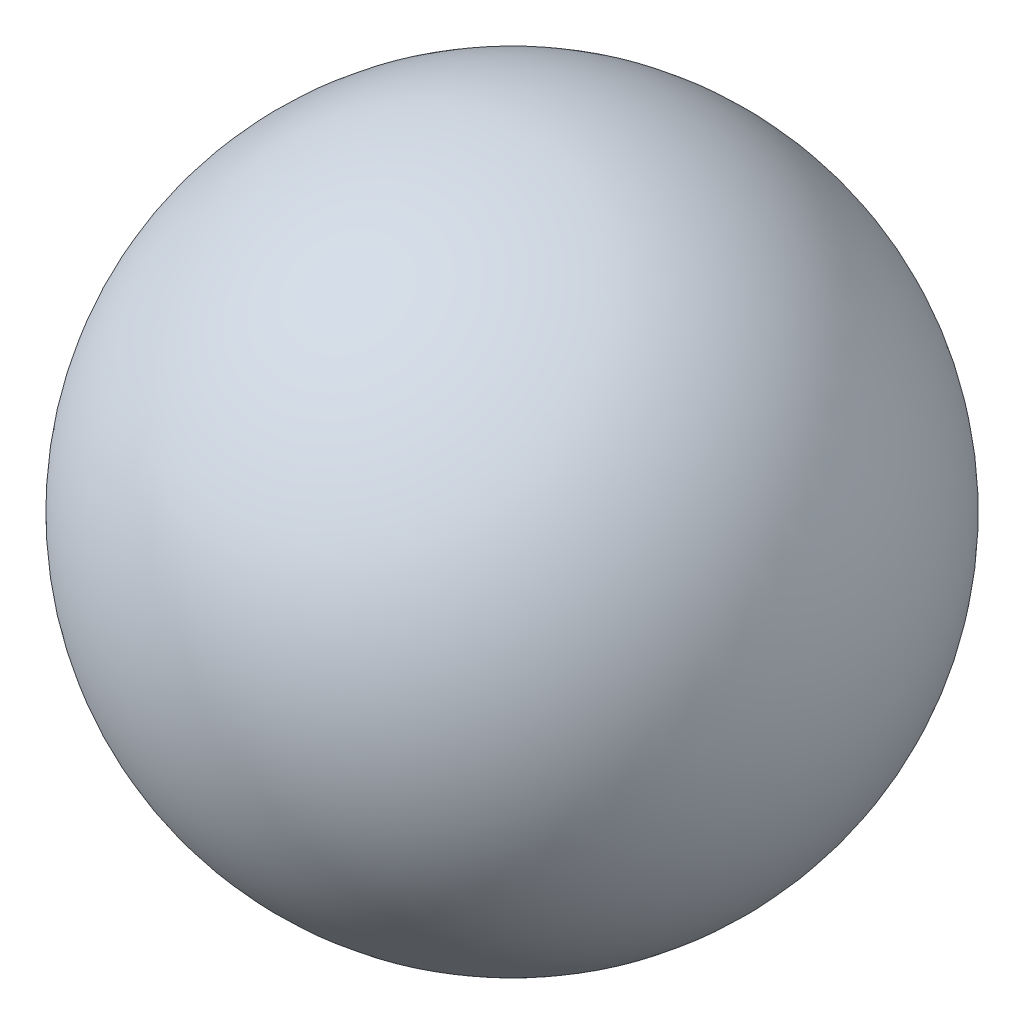
ISO-10303-21;
HEADER;
FILE_DESCRIPTION(('STEP AP214'),'2;1');
FILE_NAME('part.step','',(''),(''),'','','');
FILE_SCHEMA(('AUTOMOTIVE_DESIGN { 1 0 10303 214 1 1 1 1 }'));
ENDSEC;
DATA;
#1=APPLICATION_CONTEXT('core data for automotive mechanical design processes');
#2=APPLICATION_PROTOCOL_DEFINITION('international standard','automotive_design',2000,#1);
#3=PRODUCT_CONTEXT('',#1,'mechanical');
#4=PRODUCT('Part','Part','',(#3));
#5=PRODUCT_RELATED_PRODUCT_CATEGORY('part','',(#4));
#6=PRODUCT_DEFINITION_FORMATION('','',#4);
#7=PRODUCT_DEFINITION_CONTEXT('part definition',#1,'design');
#8=PRODUCT_DEFINITION('design','',#6,#7);
#9=PRODUCT_DEFINITION_SHAPE('','',#8);
#10=(LENGTH_UNIT() NAMED_UNIT(*) SI_UNIT(.MILLI.,.METRE.));
#11=(NAMED_UNIT(*) PLANE_ANGLE_UNIT() SI_UNIT($,.RADIAN.));
#12=(NAMED_UNIT(*) SI_UNIT($,.STERADIAN.) SOLID_ANGLE_UNIT());
#13=UNCERTAINTY_MEASURE_WITH_UNIT(LENGTH_MEASURE(1.E-05),#10,'distance_accuracy_value','');
#14=(GEOMETRIC_REPRESENTATION_CONTEXT(3) GLOBAL_UNCERTAINTY_ASSIGNED_CONTEXT((#13)) GLOBAL_UNIT_ASSIGNED_CONTEXT((#10,
#11,#12)) REPRESENTATION_CONTEXT('',''));
#15=CARTESIAN_POINT('',(0.,0.,0.));
#16=DIRECTION('',(0.,0.,1.));
#17=DIRECTION('',(1.,0.,0.));
#18=AXIS2_PLACEMENT_3D('',#15,#16,#17);
#19=CARTESIAN_POINT('',(0.,0.,0.));
#20=DIRECTION('',(0.,1.,0.));
#21=DIRECTION('',(1.,0.,0.));
#22=AXIS2_PLACEMENT_3D('',#19,#20,#21);
#23=SPHERICAL_SURFACE('',#22,12.);
#24=CARTESIAN_POINT('',(0.,12.,0.));
#25=VERTEX_POINT('',#24);
#26=VERTEX_LOOP('',#25);
#27=FACE_BOUND('',#26,.T.);
#28=ADVANCED_FACE('F33',(#27),#23,.T.);
#29=CLOSED_SHELL('',(#28));
#30=MANIFOLD_SOLID_BREP('B2',#29);
#31=ADVANCED_BREP_SHAPE_REPRESENTATION('',(#18,#30),#14);
#32=SHAPE_DEFINITION_REPRESENTATION(#9,#31);
ENDSEC;
END-ISO-10303-21;
